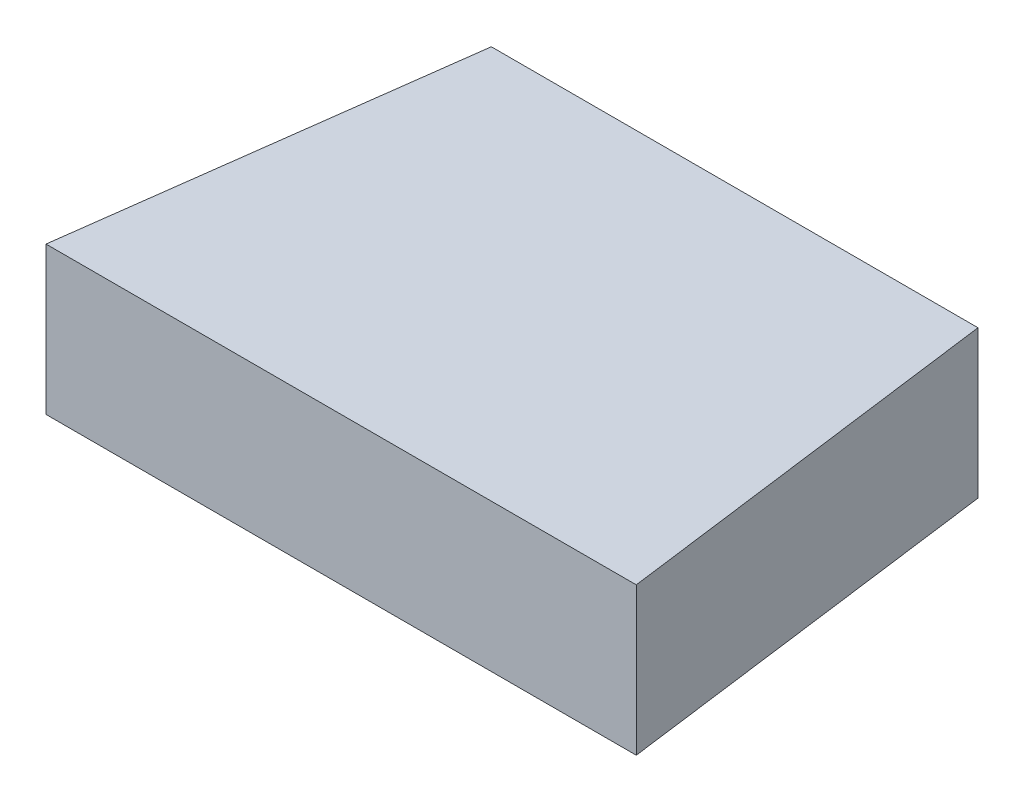
ISO-10303-21;
HEADER;
FILE_DESCRIPTION(('STEP AP214'),'2;1');
FILE_NAME('part.step','',(''),(''),'','','');
FILE_SCHEMA(('AUTOMOTIVE_DESIGN { 1 0 10303 214 1 1 1 1 }'));
ENDSEC;
DATA;
#1=APPLICATION_CONTEXT('core data for automotive mechanical design processes');
#2=APPLICATION_PROTOCOL_DEFINITION('international standard','automotive_design',2000,#1);
#3=PRODUCT_CONTEXT('',#1,'mechanical');
#4=PRODUCT('Part','Part','',(#3));
#5=PRODUCT_RELATED_PRODUCT_CATEGORY('part','',(#4));
#6=PRODUCT_DEFINITION_FORMATION('','',#4);
#7=PRODUCT_DEFINITION_CONTEXT('part definition',#1,'design');
#8=PRODUCT_DEFINITION('design','',#6,#7);
#9=PRODUCT_DEFINITION_SHAPE('','',#8);
#10=(LENGTH_UNIT() NAMED_UNIT(*) SI_UNIT(.MILLI.,.METRE.));
#11=(NAMED_UNIT(*) PLANE_ANGLE_UNIT() SI_UNIT($,.RADIAN.));
#12=(NAMED_UNIT(*) SI_UNIT($,.STERADIAN.) SOLID_ANGLE_UNIT());
#13=UNCERTAINTY_MEASURE_WITH_UNIT(LENGTH_MEASURE(1.E-05),#10,'distance_accuracy_value','');
#14=(GEOMETRIC_REPRESENTATION_CONTEXT(3) GLOBAL_UNCERTAINTY_ASSIGNED_CONTEXT((#13)) GLOBAL_UNIT_ASSIGNED_CONTEXT((#10,
#11,#12)) REPRESENTATION_CONTEXT('',''));
#15=CARTESIAN_POINT('',(0.,0.,0.));
#16=DIRECTION('',(0.,0.,1.));
#17=DIRECTION('',(1.,0.,0.));
#18=AXIS2_PLACEMENT_3D('',#15,#16,#17);
#19=CARTESIAN_POINT('',(31.4120531225604,19.05,238.598231694829));
#20=DIRECTION('',(-0.99144486137381,0.,0.130526192220051));
#21=DIRECTION('',(0.130526192220051,0.,0.99144486137381));
#22=AXIS2_PLACEMENT_3D('',#19,#20,#21);
#23=PLANE('',#22);
#24=DIRECTION('',(-0.130526192220051,0.,-0.991444861373811));
#25=VECTOR('',#24,1.);
#26=CARTESIAN_POINT('',(31.4120531225604,0.,238.598231694829));
#27=LINE('',#26,#25);
#28=CARTESIAN_POINT('',(38.1000000000001,0.,289.398231694829));
#29=VERTEX_POINT('',#28);
#30=CARTESIAN_POINT('',(31.4120531225604,0.,238.598231694829));
#31=VERTEX_POINT('',#30);
#32=EDGE_CURVE('E96',#29,#31,#27,.T.);
#33=ORIENTED_EDGE('',*,*,#32,.T.);
#34=DIRECTION('',(0.,-1.,0.));
#35=VECTOR('',#34,1.);
#36=CARTESIAN_POINT('',(31.4120531225604,19.05,238.598231694829));
#37=LINE('',#36,#35);
#38=CARTESIAN_POINT('',(31.4120531225604,19.05,238.598231694829));
#39=VERTEX_POINT('',#38);
#40=EDGE_CURVE('E11',#39,#31,#37,.T.);
#41=ORIENTED_EDGE('',*,*,#40,.F.);
#42=DIRECTION('',(-0.130526192220051,0.,-0.991444861373811));
#43=VECTOR('',#42,1.);
#44=CARTESIAN_POINT('',(31.4120531225604,19.05,238.598231694829));
#45=LINE('',#44,#43);
#46=CARTESIAN_POINT('',(38.1000000000001,19.05,289.398231694829));
#47=VERTEX_POINT('',#46);
#48=EDGE_CURVE('E84',#47,#39,#45,.T.);
#49=ORIENTED_EDGE('',*,*,#48,.F.);
#50=DIRECTION('',(0.,-1.,0.));
#51=VECTOR('',#50,1.);
#52=CARTESIAN_POINT('',(38.1000000000001,19.05,289.398231694829));
#53=LINE('',#52,#51);
#54=EDGE_CURVE('E92',#47,#29,#53,.T.);
#55=ORIENTED_EDGE('',*,*,#54,.T.);
#56=EDGE_LOOP('',(#33,#41,#49,#55));
#57=FACE_BOUND('',#56,.T.);
#58=ADVANCED_FACE('F33',(#57),#23,.F.);
#59=CARTESIAN_POINT('',(-31.4120531225602,19.05,238.598231694829));
#60=DIRECTION('',(0.,0.,1.));
#61=DIRECTION('',(1.,0.,0.));
#62=AXIS2_PLACEMENT_3D('',#59,#60,#61);
#63=PLANE('',#62);
#64=DIRECTION('',(-1.,0.,0.));
#65=VECTOR('',#64,1.);
#66=CARTESIAN_POINT('',(-31.4120531225602,0.,238.598231694829));
#67=LINE('',#66,#65);
#68=CARTESIAN_POINT('',(-31.4120531225602,0.,238.598231694829));
#69=VERTEX_POINT('',#68);
#70=EDGE_CURVE('E88',#31,#69,#67,.T.);
#71=ORIENTED_EDGE('',*,*,#70,.T.);
#72=DIRECTION('',(0.,-1.,0.));
#73=VECTOR('',#72,1.);
#74=CARTESIAN_POINT('',(-31.4120531225602,19.05,238.598231694829));
#75=LINE('',#74,#73);
#76=CARTESIAN_POINT('',(-31.4120531225602,19.05,238.598231694829));
#77=VERTEX_POINT('',#76);
#78=EDGE_CURVE('E41',#77,#69,#75,.T.);
#79=ORIENTED_EDGE('',*,*,#78,.F.);
#80=DIRECTION('',(-1.,0.,0.));
#81=VECTOR('',#80,1.);
#82=CARTESIAN_POINT('',(-31.4120531225602,19.05,238.598231694829));
#83=LINE('',#82,#81);
#84=EDGE_CURVE('E79',#39,#77,#83,.T.);
#85=ORIENTED_EDGE('',*,*,#84,.F.);
#86=ORIENTED_EDGE('',*,*,#40,.T.);
#87=EDGE_LOOP('',(#71,#79,#85,#86));
#88=FACE_BOUND('',#87,.T.);
#89=ADVANCED_FACE('F87',(#88),#63,.F.);
#90=CARTESIAN_POINT('',(-31.4120531225602,19.05,238.598231694829));
#91=DIRECTION('',(0.99144486137381,0.,0.130526192220051));
#92=DIRECTION('',(0.130526192220051,0.,-0.99144486137381));
#93=AXIS2_PLACEMENT_3D('',#90,#91,#92);
#94=PLANE('',#93);
#95=DIRECTION('',(-0.130526192220051,0.,0.991444861373811));
#96=VECTOR('',#95,1.);
#97=CARTESIAN_POINT('',(-31.4120531225602,0.,238.598231694829));
#98=LINE('',#97,#96);
#99=CARTESIAN_POINT('',(-38.0999999999999,0.,289.398231694829));
#100=VERTEX_POINT('',#99);
#101=EDGE_CURVE('E66',#69,#100,#98,.T.);
#102=ORIENTED_EDGE('',*,*,#101,.T.);
#103=DIRECTION('',(0.,-1.,0.));
#104=VECTOR('',#103,1.);
#105=CARTESIAN_POINT('',(-38.0999999999999,19.05,289.398231694829));
#106=LINE('',#105,#104);
#107=CARTESIAN_POINT('',(-38.0999999999999,19.05,289.398231694829));
#108=VERTEX_POINT('',#107);
#109=EDGE_CURVE('E89',#108,#100,#106,.T.);
#110=ORIENTED_EDGE('',*,*,#109,.F.);
#111=DIRECTION('',(-0.130526192220051,0.,0.991444861373811));
#112=VECTOR('',#111,1.);
#113=CARTESIAN_POINT('',(-31.4120531225602,19.05,238.598231694829));
#114=LINE('',#113,#112);
#115=EDGE_CURVE('E82',#77,#108,#114,.T.);
#116=ORIENTED_EDGE('',*,*,#115,.F.);
#117=ORIENTED_EDGE('',*,*,#78,.T.);
#118=EDGE_LOOP('',(#102,#110,#116,#117));
#119=FACE_BOUND('',#118,.T.);
#120=ADVANCED_FACE('F90',(#119),#94,.F.);
#121=CARTESIAN_POINT('',(-38.0999999999999,19.05,289.398231694829));
#122=DIRECTION('',(0.,0.,-1.));
#123=DIRECTION('',(-1.,0.,0.));
#124=AXIS2_PLACEMENT_3D('',#121,#122,#123);
#125=PLANE('',#124);
#126=DIRECTION('',(1.,0.,0.));
#127=VECTOR('',#126,1.);
#128=CARTESIAN_POINT('',(-38.0999999999999,0.,289.398231694829));
#129=LINE('',#128,#127);
#130=EDGE_CURVE('E72',#100,#29,#129,.T.);
#131=ORIENTED_EDGE('',*,*,#130,.T.);
#132=ORIENTED_EDGE('',*,*,#54,.F.);
#133=DIRECTION('',(1.,0.,0.));
#134=VECTOR('',#133,1.);
#135=CARTESIAN_POINT('',(-38.0999999999999,19.05,289.398231694829));
#136=LINE('',#135,#134);
#137=EDGE_CURVE('E49',#108,#47,#136,.T.);
#138=ORIENTED_EDGE('',*,*,#137,.F.);
#139=ORIENTED_EDGE('',*,*,#109,.T.);
#140=EDGE_LOOP('',(#131,#132,#138,#139));
#141=FACE_BOUND('',#140,.T.);
#142=ADVANCED_FACE('F103',(#141),#125,.F.);
#143=CARTESIAN_POINT('',(0.,19.05,0.));
#144=DIRECTION('',(0.,1.,0.));
#145=DIRECTION('',(0.,0.,1.));
#146=AXIS2_PLACEMENT_3D('',#143,#144,#145);
#147=PLANE('',#146);
#148=ORIENTED_EDGE('',*,*,#48,.T.);
#149=ORIENTED_EDGE('',*,*,#84,.T.);
#150=ORIENTED_EDGE('',*,*,#115,.T.);
#151=ORIENTED_EDGE('',*,*,#137,.T.);
#152=EDGE_LOOP('',(#148,#149,#150,#151));
#153=FACE_BOUND('',#152,.T.);
#154=ADVANCED_FACE('F80',(#153),#147,.T.);
#155=CARTESIAN_POINT('',(0.,0.,0.));
#156=DIRECTION('',(0.,1.,0.));
#157=DIRECTION('',(0.,0.,1.));
#158=AXIS2_PLACEMENT_3D('',#155,#156,#157);
#159=PLANE('',#158);
#160=ORIENTED_EDGE('',*,*,#32,.F.);
#161=ORIENTED_EDGE('',*,*,#130,.F.);
#162=ORIENTED_EDGE('',*,*,#101,.F.);
#163=ORIENTED_EDGE('',*,*,#70,.F.);
#164=EDGE_LOOP('',(#160,#161,#162,#163));
#165=FACE_BOUND('',#164,.T.);
#166=ADVANCED_FACE('F106',(#165),#159,.F.);
#167=CLOSED_SHELL('',(#58,#89,#120,#142,#154,#166));
#168=MANIFOLD_SOLID_BREP('B2',#167);
#169=ADVANCED_BREP_SHAPE_REPRESENTATION('',(#18,#168),#14);
#170=SHAPE_DEFINITION_REPRESENTATION(#9,#169);
ENDSEC;
END-ISO-10303-21;
